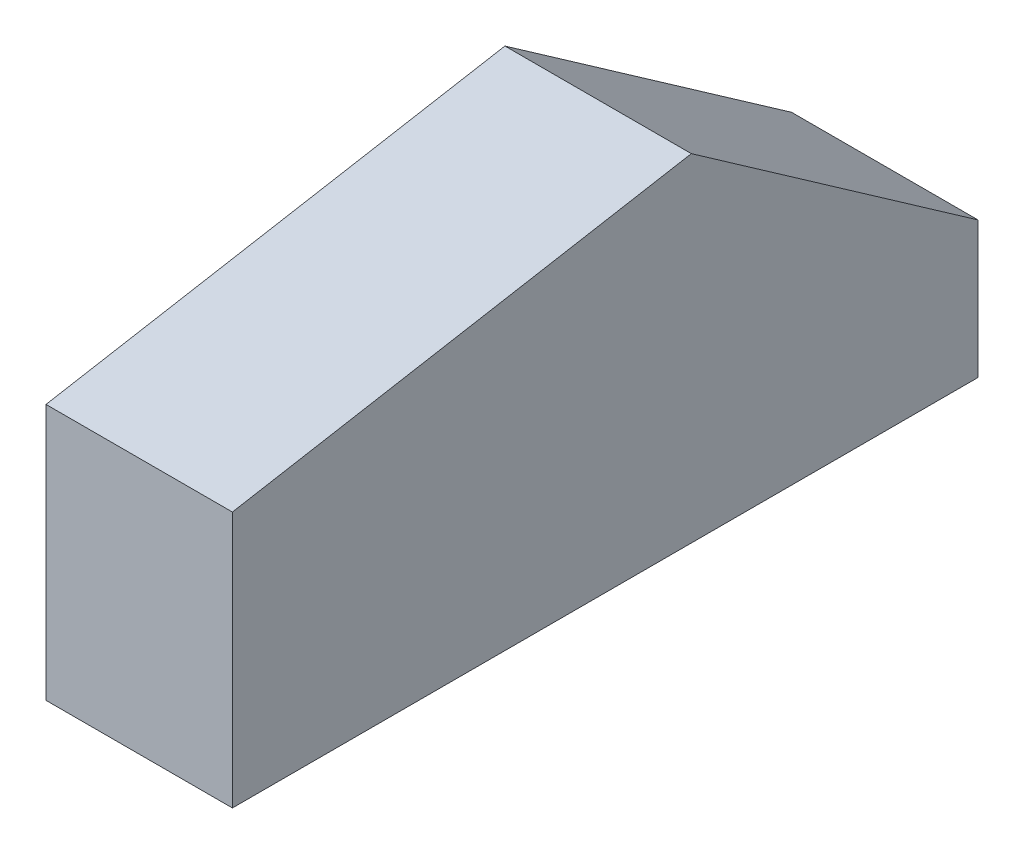
ISO-10303-21;
HEADER;
FILE_DESCRIPTION(('STEP AP214'),'2;1');
FILE_NAME('part.step','',(''),(''),'','','');
FILE_SCHEMA(('AUTOMOTIVE_DESIGN { 1 0 10303 214 1 1 1 1 }'));
ENDSEC;
DATA;
#1=APPLICATION_CONTEXT('core data for automotive mechanical design processes');
#2=APPLICATION_PROTOCOL_DEFINITION('international standard','automotive_design',2000,#1);
#3=PRODUCT_CONTEXT('',#1,'mechanical');
#4=PRODUCT('Part','Part','',(#3));
#5=PRODUCT_RELATED_PRODUCT_CATEGORY('part','',(#4));
#6=PRODUCT_DEFINITION_FORMATION('','',#4);
#7=PRODUCT_DEFINITION_CONTEXT('part definition',#1,'design');
#8=PRODUCT_DEFINITION('design','',#6,#7);
#9=PRODUCT_DEFINITION_SHAPE('','',#8);
#10=(LENGTH_UNIT() NAMED_UNIT(*) SI_UNIT(.MILLI.,.METRE.));
#11=(NAMED_UNIT(*) PLANE_ANGLE_UNIT() SI_UNIT($,.RADIAN.));
#12=(NAMED_UNIT(*) SI_UNIT($,.STERADIAN.) SOLID_ANGLE_UNIT());
#13=UNCERTAINTY_MEASURE_WITH_UNIT(LENGTH_MEASURE(1.E-05),#10,'distance_accuracy_value','');
#14=(GEOMETRIC_REPRESENTATION_CONTEXT(3) GLOBAL_UNCERTAINTY_ASSIGNED_CONTEXT((#13)) GLOBAL_UNIT_ASSIGNED_CONTEXT((#10,
#11,#12)) REPRESENTATION_CONTEXT('',''));
#15=CARTESIAN_POINT('',(0.,0.,0.));
#16=DIRECTION('',(0.,0.,1.));
#17=DIRECTION('',(1.,0.,0.));
#18=AXIS2_PLACEMENT_3D('',#15,#16,#17);
#19=CARTESIAN_POINT('',(1.,0.,0.));
#20=DIRECTION('',(0.,1.,0.));
#21=DIRECTION('',(0.,0.,1.));
#22=AXIS2_PLACEMENT_3D('',#19,#20,#21);
#23=PLANE('',#22);
#24=DIRECTION('',(0.,0.,-1.));
#25=VECTOR('',#24,1.);
#26=CARTESIAN_POINT('',(0.,0.,0.));
#27=LINE('',#26,#25);
#28=CARTESIAN_POINT('',(0.,0.,0.));
#29=VERTEX_POINT('',#28);
#30=CARTESIAN_POINT('',(0.,0.,-4.));
#31=VERTEX_POINT('',#30);
#32=EDGE_CURVE('E110',#29,#31,#27,.T.);
#33=ORIENTED_EDGE('',*,*,#32,.T.);
#34=DIRECTION('',(-1.,0.,0.));
#35=VECTOR('',#34,1.);
#36=CARTESIAN_POINT('',(1.,0.,-4.));
#37=LINE('',#36,#35);
#38=CARTESIAN_POINT('',(1.,0.,-4.));
#39=VERTEX_POINT('',#38);
#40=EDGE_CURVE('E11',#39,#31,#37,.T.);
#41=ORIENTED_EDGE('',*,*,#40,.F.);
#42=DIRECTION('',(0.,0.,-1.));
#43=VECTOR('',#42,1.);
#44=CARTESIAN_POINT('',(1.,0.,0.));
#45=LINE('',#44,#43);
#46=CARTESIAN_POINT('',(1.,0.,0.));
#47=VERTEX_POINT('',#46);
#48=EDGE_CURVE('E121',#47,#39,#45,.T.);
#49=ORIENTED_EDGE('',*,*,#48,.F.);
#50=DIRECTION('',(-1.,0.,0.));
#51=VECTOR('',#50,1.);
#52=CARTESIAN_POINT('',(1.,0.,0.));
#53=LINE('',#52,#51);
#54=EDGE_CURVE('E52',#47,#29,#53,.T.);
#55=ORIENTED_EDGE('',*,*,#54,.T.);
#56=EDGE_LOOP('',(#33,#41,#49,#55));
#57=FACE_BOUND('',#56,.T.);
#58=ADVANCED_FACE('F36',(#57),#23,.F.);
#59=CARTESIAN_POINT('',(1.,0.,-4.));
#60=DIRECTION('',(0.,0.,1.));
#61=DIRECTION('',(1.,0.,0.));
#62=AXIS2_PLACEMENT_3D('',#59,#60,#61);
#63=PLANE('',#62);
#64=DIRECTION('',(0.,1.,0.));
#65=VECTOR('',#64,1.);
#66=CARTESIAN_POINT('',(0.,0.,-4.));
#67=LINE('',#66,#65);
#68=CARTESIAN_POINT('',(0.,0.732214822194771,-4.));
#69=VERTEX_POINT('',#68);
#70=EDGE_CURVE('E112',#31,#69,#67,.T.);
#71=ORIENTED_EDGE('',*,*,#70,.T.);
#72=DIRECTION('',(-1.,0.,0.));
#73=VECTOR('',#72,1.);
#74=CARTESIAN_POINT('',(1.,0.732214822194771,-4.));
#75=LINE('',#74,#73);
#76=CARTESIAN_POINT('',(1.,0.732214822194771,-4.));
#77=VERTEX_POINT('',#76);
#78=EDGE_CURVE('E44',#77,#69,#75,.T.);
#79=ORIENTED_EDGE('',*,*,#78,.F.);
#80=DIRECTION('',(0.,1.,0.));
#81=VECTOR('',#80,1.);
#82=CARTESIAN_POINT('',(1.,0.,-4.));
#83=LINE('',#82,#81);
#84=EDGE_CURVE('E81',#39,#77,#83,.T.);
#85=ORIENTED_EDGE('',*,*,#84,.F.);
#86=ORIENTED_EDGE('',*,*,#40,.T.);
#87=EDGE_LOOP('',(#71,#79,#85,#86));
#88=FACE_BOUND('',#87,.T.);
#89=ADVANCED_FACE('F123',(#88),#63,.F.);
#90=CARTESIAN_POINT('',(1.,1.80912044416733,-2.46201938253052));
#91=DIRECTION('',(0.,0.819152044288991,-0.573576436351047));
#92=DIRECTION('',(0.,0.573576436351047,0.819152044288991));
#93=AXIS2_PLACEMENT_3D('',#90,#91,#92);
#94=PLANE('',#93);
#95=DIRECTION('',(0.,-0.573576436351047,-0.819152044288991));
#96=VECTOR('',#95,1.);
#97=CARTESIAN_POINT('',(0.,1.80912044416733,-2.46201938253052));
#98=LINE('',#97,#96);
#99=CARTESIAN_POINT('',(0.,1.80912044416733,-2.46201938253052));
#100=VERTEX_POINT('',#99);
#101=EDGE_CURVE('E93',#100,#69,#98,.T.);
#102=ORIENTED_EDGE('',*,*,#101,.F.);
#103=DIRECTION('',(-1.,0.,0.));
#104=VECTOR('',#103,1.);
#105=CARTESIAN_POINT('',(1.,1.80912044416733,-2.46201938253052));
#106=LINE('',#105,#104);
#107=CARTESIAN_POINT('',(1.,1.80912044416733,-2.46201938253052));
#108=VERTEX_POINT('',#107);
#109=EDGE_CURVE('E88',#108,#100,#106,.T.);
#110=ORIENTED_EDGE('',*,*,#109,.F.);
#111=DIRECTION('',(0.,-0.573576436351047,-0.819152044288991));
#112=VECTOR('',#111,1.);
#113=CARTESIAN_POINT('',(1.,1.80912044416733,-2.46201938253052));
#114=LINE('',#113,#112);
#115=EDGE_CURVE('E91',#108,#77,#114,.T.);
#116=ORIENTED_EDGE('',*,*,#115,.T.);
#117=ORIENTED_EDGE('',*,*,#78,.T.);
#118=EDGE_LOOP('',(#102,#110,#116,#117));
#119=FACE_BOUND('',#118,.T.);
#120=ADVANCED_FACE('F90',(#119),#94,.T.);
#121=CARTESIAN_POINT('',(1.,1.375,0.));
#122=DIRECTION('',(0.,0.984807753012208,0.173648177666931));
#123=DIRECTION('',(0.,-0.173648177666931,0.984807753012208));
#124=AXIS2_PLACEMENT_3D('',#121,#122,#123);
#125=PLANE('',#124);
#126=DIRECTION('',(0.,0.173648177666931,-0.984807753012208));
#127=VECTOR('',#126,1.);
#128=CARTESIAN_POINT('',(0.,1.375,0.));
#129=LINE('',#128,#127);
#130=CARTESIAN_POINT('',(0.,1.375,0.));
#131=VERTEX_POINT('',#130);
#132=EDGE_CURVE('E116',#131,#100,#129,.T.);
#133=ORIENTED_EDGE('',*,*,#132,.F.);
#134=DIRECTION('',(-1.,0.,0.));
#135=VECTOR('',#134,1.);
#136=CARTESIAN_POINT('',(1.,1.375,0.));
#137=LINE('',#136,#135);
#138=CARTESIAN_POINT('',(1.,1.375,0.));
#139=VERTEX_POINT('',#138);
#140=EDGE_CURVE('E69',#139,#131,#137,.T.);
#141=ORIENTED_EDGE('',*,*,#140,.F.);
#142=DIRECTION('',(0.,0.173648177666931,-0.984807753012208));
#143=VECTOR('',#142,1.);
#144=CARTESIAN_POINT('',(1.,1.375,0.));
#145=LINE('',#144,#143);
#146=EDGE_CURVE('E102',#139,#108,#145,.T.);
#147=ORIENTED_EDGE('',*,*,#146,.T.);
#148=ORIENTED_EDGE('',*,*,#109,.T.);
#149=EDGE_LOOP('',(#133,#141,#147,#148));
#150=FACE_BOUND('',#149,.T.);
#151=ADVANCED_FACE('F104',(#150),#125,.T.);
#152=CARTESIAN_POINT('',(1.,0.,0.));
#153=DIRECTION('',(0.,0.,1.));
#154=DIRECTION('',(1.,0.,0.));
#155=AXIS2_PLACEMENT_3D('',#152,#153,#154);
#156=PLANE('',#155);
#157=DIRECTION('',(0.,1.,0.));
#158=VECTOR('',#157,1.);
#159=CARTESIAN_POINT('',(0.,0.,0.));
#160=LINE('',#159,#158);
#161=EDGE_CURVE('E118',#29,#131,#160,.T.);
#162=ORIENTED_EDGE('',*,*,#161,.F.);
#163=ORIENTED_EDGE('',*,*,#54,.F.);
#164=DIRECTION('',(0.,1.,0.));
#165=VECTOR('',#164,1.);
#166=CARTESIAN_POINT('',(1.,0.,0.));
#167=LINE('',#166,#165);
#168=EDGE_CURVE('E105',#47,#139,#167,.T.);
#169=ORIENTED_EDGE('',*,*,#168,.T.);
#170=ORIENTED_EDGE('',*,*,#140,.T.);
#171=EDGE_LOOP('',(#162,#163,#169,#170));
#172=FACE_BOUND('',#171,.T.);
#173=ADVANCED_FACE('F127',(#172),#156,.T.);
#174=CARTESIAN_POINT('',(1.,0.,0.));
#175=DIRECTION('',(1.,0.,0.));
#176=DIRECTION('',(0.,0.,-1.));
#177=AXIS2_PLACEMENT_3D('',#174,#175,#176);
#178=PLANE('',#177);
#179=ORIENTED_EDGE('',*,*,#48,.T.);
#180=ORIENTED_EDGE('',*,*,#84,.T.);
#181=ORIENTED_EDGE('',*,*,#115,.F.);
#182=ORIENTED_EDGE('',*,*,#146,.F.);
#183=ORIENTED_EDGE('',*,*,#168,.F.);
#184=EDGE_LOOP('',(#179,#180,#181,#182,#183));
#185=FACE_BOUND('',#184,.T.);
#186=ADVANCED_FACE('F100',(#185),#178,.T.);
#187=CARTESIAN_POINT('',(0.,0.,0.));
#188=DIRECTION('',(1.,0.,0.));
#189=DIRECTION('',(0.,0.,-1.));
#190=AXIS2_PLACEMENT_3D('',#187,#188,#189);
#191=PLANE('',#190);
#192=ORIENTED_EDGE('',*,*,#32,.F.);
#193=ORIENTED_EDGE('',*,*,#161,.T.);
#194=ORIENTED_EDGE('',*,*,#132,.T.);
#195=ORIENTED_EDGE('',*,*,#101,.T.);
#196=ORIENTED_EDGE('',*,*,#70,.F.);
#197=EDGE_LOOP('',(#192,#193,#194,#195,#196));
#198=FACE_BOUND('',#197,.T.);
#199=ADVANCED_FACE('F126',(#198),#191,.F.);
#200=CLOSED_SHELL('',(#58,#89,#120,#151,#173,#186,#199));
#201=MANIFOLD_SOLID_BREP('B2',#200);
#202=ADVANCED_BREP_SHAPE_REPRESENTATION('',(#18,#201),#14);
#203=SHAPE_DEFINITION_REPRESENTATION(#9,#202);
ENDSEC;
END-ISO-10303-21;
